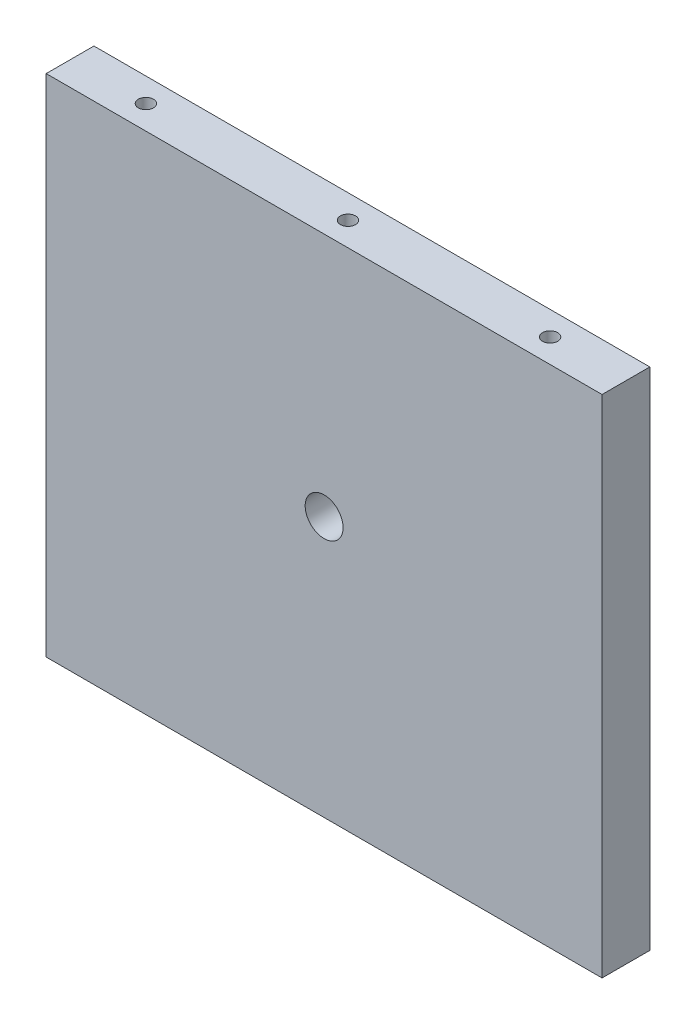
ISO-10303-21;
HEADER;
FILE_DESCRIPTION(('STEP AP214'),'2;1');
FILE_NAME('part.step','',(''),(''),'','','');
FILE_SCHEMA(('AUTOMOTIVE_DESIGN { 1 0 10303 214 1 1 1 1 }'));
ENDSEC;
DATA;
#1=APPLICATION_CONTEXT('core data for automotive mechanical design processes');
#2=APPLICATION_PROTOCOL_DEFINITION('international standard','automotive_design',2000,#1);
#3=PRODUCT_CONTEXT('',#1,'mechanical');
#4=PRODUCT('Part','Part','',(#3));
#5=PRODUCT_RELATED_PRODUCT_CATEGORY('part','',(#4));
#6=PRODUCT_DEFINITION_FORMATION('','',#4);
#7=PRODUCT_DEFINITION_CONTEXT('part definition',#1,'design');
#8=PRODUCT_DEFINITION('design','',#6,#7);
#9=PRODUCT_DEFINITION_SHAPE('','',#8);
#10=(LENGTH_UNIT() NAMED_UNIT(*) SI_UNIT(.MILLI.,.METRE.));
#11=(NAMED_UNIT(*) PLANE_ANGLE_UNIT() SI_UNIT($,.RADIAN.));
#12=(NAMED_UNIT(*) SI_UNIT($,.STERADIAN.) SOLID_ANGLE_UNIT());
#13=UNCERTAINTY_MEASURE_WITH_UNIT(LENGTH_MEASURE(1.E-05),#10,'distance_accuracy_value','');
#14=(GEOMETRIC_REPRESENTATION_CONTEXT(3) GLOBAL_UNCERTAINTY_ASSIGNED_CONTEXT((#13)) GLOBAL_UNIT_ASSIGNED_CONTEXT((#10,
#11,#12)) REPRESENTATION_CONTEXT('',''));
#15=CARTESIAN_POINT('',(0.,0.,0.));
#16=DIRECTION('',(0.,0.,1.));
#17=DIRECTION('',(1.,0.,0.));
#18=AXIS2_PLACEMENT_3D('',#15,#16,#17);
#19=CARTESIAN_POINT('',(0.,0.,12.));
#20=DIRECTION('',(0.,0.,1.));
#21=DIRECTION('',(1.,0.,0.));
#22=AXIS2_PLACEMENT_3D('',#19,#20,#21);
#23=PLANE('',#22);
#24=DIRECTION('',(0.,1.,0.));
#25=VECTOR('',#24,1.);
#26=CARTESIAN_POINT('',(69.85,76.2,12.));
#27=LINE('',#26,#25);
#28=CARTESIAN_POINT('',(69.85,-50.8,12.));
#29=VERTEX_POINT('',#28);
#30=CARTESIAN_POINT('',(69.85,76.2,12.));
#31=VERTEX_POINT('',#30);
#32=EDGE_CURVE('E177',#29,#31,#27,.T.);
#33=ORIENTED_EDGE('',*,*,#32,.T.);
#34=DIRECTION('',(-1.,0.,0.));
#35=VECTOR('',#34,1.);
#36=CARTESIAN_POINT('',(-69.85,76.2,12.));
#37=LINE('',#36,#35);
#38=CARTESIAN_POINT('',(-69.85,76.2,12.));
#39=VERTEX_POINT('',#38);
#40=EDGE_CURVE('E92',#31,#39,#37,.T.);
#41=ORIENTED_EDGE('',*,*,#40,.T.);
#42=DIRECTION('',(0.,-1.,0.));
#43=VECTOR('',#42,1.);
#44=CARTESIAN_POINT('',(-69.85,76.2,12.));
#45=LINE('',#44,#43);
#46=CARTESIAN_POINT('',(-69.85,-50.8,12.));
#47=VERTEX_POINT('',#46);
#48=EDGE_CURVE('E182',#39,#47,#45,.T.);
#49=ORIENTED_EDGE('',*,*,#48,.T.);
#50=DIRECTION('',(1.,0.,0.));
#51=VECTOR('',#50,1.);
#52=CARTESIAN_POINT('',(-69.85,-50.8,12.));
#53=LINE('',#52,#51);
#54=EDGE_CURVE('E61',#47,#29,#53,.T.);
#55=ORIENTED_EDGE('',*,*,#54,.T.);
#56=EDGE_LOOP('',(#33,#41,#49,#55));
#57=FACE_BOUND('',#56,.T.);
#58=CARTESIAN_POINT('',(0.,14.67,12.));
#59=DIRECTION('',(0.,0.,1.));
#60=DIRECTION('',(1.,0.,0.));
#61=AXIS2_PLACEMENT_3D('',#58,#59,#60);
#62=CIRCLE('',#61,4.7625);
#63=CARTESIAN_POINT('',(4.7625,14.67,12.));
#64=VERTEX_POINT('',#63);
#65=EDGE_CURVE('E169',#64,#64,#62,.T.);
#66=ORIENTED_EDGE('',*,*,#65,.F.);
#67=EDGE_LOOP('',(#66));
#68=FACE_BOUND('',#67,.T.);
#69=ADVANCED_FACE('F43',(#57,#68),#23,.T.);
#70=CARTESIAN_POINT('',(0.,0.,0.));
#71=DIRECTION('',(0.,0.,1.));
#72=DIRECTION('',(1.,0.,0.));
#73=AXIS2_PLACEMENT_3D('',#70,#71,#72);
#74=PLANE('',#73);
#75=DIRECTION('',(0.,1.,0.));
#76=VECTOR('',#75,1.);
#77=CARTESIAN_POINT('',(69.85,76.2,0.));
#78=LINE('',#77,#76);
#79=CARTESIAN_POINT('',(69.85,-50.8,0.));
#80=VERTEX_POINT('',#79);
#81=CARTESIAN_POINT('',(69.85,76.2,0.));
#82=VERTEX_POINT('',#81);
#83=EDGE_CURVE('E173',#80,#82,#78,.T.);
#84=ORIENTED_EDGE('',*,*,#83,.F.);
#85=DIRECTION('',(1.,0.,0.));
#86=VECTOR('',#85,1.);
#87=CARTESIAN_POINT('',(-69.85,-50.8,0.));
#88=LINE('',#87,#86);
#89=CARTESIAN_POINT('',(-69.85,-50.8,0.));
#90=VERTEX_POINT('',#89);
#91=EDGE_CURVE('E85',#90,#80,#88,.T.);
#92=ORIENTED_EDGE('',*,*,#91,.F.);
#93=DIRECTION('',(0.,-1.,0.));
#94=VECTOR('',#93,1.);
#95=CARTESIAN_POINT('',(-69.85,76.2,0.));
#96=LINE('',#95,#94);
#97=CARTESIAN_POINT('',(-69.85,76.2,0.));
#98=VERTEX_POINT('',#97);
#99=EDGE_CURVE('E79',#98,#90,#96,.T.);
#100=ORIENTED_EDGE('',*,*,#99,.F.);
#101=DIRECTION('',(-1.,0.,0.));
#102=VECTOR('',#101,1.);
#103=CARTESIAN_POINT('',(-69.85,76.2,0.));
#104=LINE('',#103,#102);
#105=EDGE_CURVE('E191',#82,#98,#104,.T.);
#106=ORIENTED_EDGE('',*,*,#105,.F.);
#107=EDGE_LOOP('',(#84,#92,#100,#106));
#108=FACE_BOUND('',#107,.T.);
#109=CARTESIAN_POINT('',(0.,14.67,0.));
#110=DIRECTION('',(0.,0.,1.));
#111=DIRECTION('',(1.,0.,0.));
#112=AXIS2_PLACEMENT_3D('',#109,#110,#111);
#113=CIRCLE('',#112,4.7625);
#114=CARTESIAN_POINT('',(4.7625,14.67,0.));
#115=VERTEX_POINT('',#114);
#116=EDGE_CURVE('E168',#115,#115,#113,.T.);
#117=ORIENTED_EDGE('',*,*,#116,.T.);
#118=EDGE_LOOP('',(#117));
#119=FACE_BOUND('',#118,.T.);
#120=ADVANCED_FACE('F207',(#108,#119),#74,.F.);
#121=CARTESIAN_POINT('',(69.85,76.2,12.));
#122=DIRECTION('',(-1.,0.,0.));
#123=DIRECTION('',(0.,0.,1.));
#124=AXIS2_PLACEMENT_3D('',#121,#122,#123);
#125=PLANE('',#124);
#126=ORIENTED_EDGE('',*,*,#83,.T.);
#127=DIRECTION('',(0.,0.,-1.));
#128=VECTOR('',#127,1.);
#129=CARTESIAN_POINT('',(69.85,76.2,12.));
#130=LINE('',#129,#128);
#131=EDGE_CURVE('E11',#31,#82,#130,.T.);
#132=ORIENTED_EDGE('',*,*,#131,.F.);
#133=ORIENTED_EDGE('',*,*,#32,.F.);
#134=DIRECTION('',(0.,0.,-1.));
#135=VECTOR('',#134,1.);
#136=CARTESIAN_POINT('',(69.85,-50.8,12.));
#137=LINE('',#136,#135);
#138=EDGE_CURVE('E187',#29,#80,#137,.T.);
#139=ORIENTED_EDGE('',*,*,#138,.T.);
#140=EDGE_LOOP('',(#126,#132,#133,#139));
#141=FACE_BOUND('',#140,.T.);
#142=ADVANCED_FACE('F45',(#141),#125,.F.);
#143=CARTESIAN_POINT('',(-69.85,76.2,12.));
#144=DIRECTION('',(0.,-1.,0.));
#145=DIRECTION('',(0.,0.,-1.));
#146=AXIS2_PLACEMENT_3D('',#143,#144,#145);
#147=PLANE('',#146);
#148=CARTESIAN_POINT('',(50.8,76.2,6.));
#149=DIRECTION('',(0.,1.,0.));
#150=DIRECTION('',(0.,0.,1.));
#151=AXIS2_PLACEMENT_3D('',#148,#149,#150);
#152=CIRCLE('',#151,1.89864999999999);
#153=CARTESIAN_POINT('',(50.8,76.2,7.89864999999999));
#154=VERTEX_POINT('',#153);
#155=EDGE_CURVE('E123',#154,#154,#152,.T.);
#156=ORIENTED_EDGE('',*,*,#155,.F.);
#157=EDGE_LOOP('',(#156));
#158=FACE_BOUND('',#157,.T.);
#159=CARTESIAN_POINT('',(0.,76.2,6.));
#160=DIRECTION('',(0.,1.,0.));
#161=DIRECTION('',(0.,0.,1.));
#162=AXIS2_PLACEMENT_3D('',#159,#160,#161);
#163=CIRCLE('',#162,1.89864999999999);
#164=CARTESIAN_POINT('',(0.,76.2,7.89864999999999));
#165=VERTEX_POINT('',#164);
#166=EDGE_CURVE('E122',#165,#165,#163,.T.);
#167=ORIENTED_EDGE('',*,*,#166,.F.);
#168=EDGE_LOOP('',(#167));
#169=FACE_BOUND('',#168,.T.);
#170=CARTESIAN_POINT('',(-50.8,76.2,6.));
#171=DIRECTION('',(0.,1.,0.));
#172=DIRECTION('',(0.,0.,1.));
#173=AXIS2_PLACEMENT_3D('',#170,#171,#172);
#174=CIRCLE('',#173,1.89864999999999);
#175=CARTESIAN_POINT('',(-50.8,76.2,7.89864999999999));
#176=VERTEX_POINT('',#175);
#177=EDGE_CURVE('E136',#176,#176,#174,.T.);
#178=ORIENTED_EDGE('',*,*,#177,.F.);
#179=EDGE_LOOP('',(#178));
#180=FACE_BOUND('',#179,.T.);
#181=ORIENTED_EDGE('',*,*,#105,.T.);
#182=DIRECTION('',(0.,0.,-1.));
#183=VECTOR('',#182,1.);
#184=CARTESIAN_POINT('',(-69.85,76.2,12.));
#185=LINE('',#184,#183);
#186=EDGE_CURVE('E53',#39,#98,#185,.T.);
#187=ORIENTED_EDGE('',*,*,#186,.F.);
#188=ORIENTED_EDGE('',*,*,#40,.F.);
#189=ORIENTED_EDGE('',*,*,#131,.T.);
#190=EDGE_LOOP('',(#181,#187,#188,#189));
#191=FACE_BOUND('',#190,.T.);
#192=ADVANCED_FACE('F224',(#158,#169,#180,#191),#147,.F.);
#193=CARTESIAN_POINT('',(-69.85,76.2,12.));
#194=DIRECTION('',(1.,0.,0.));
#195=DIRECTION('',(0.,1.,0.));
#196=AXIS2_PLACEMENT_3D('',#193,#194,#195);
#197=PLANE('',#196);
#198=ORIENTED_EDGE('',*,*,#99,.T.);
#199=DIRECTION('',(0.,0.,-1.));
#200=VECTOR('',#199,1.);
#201=CARTESIAN_POINT('',(-69.85,-50.8,12.));
#202=LINE('',#201,#200);
#203=EDGE_CURVE('E200',#47,#90,#202,.T.);
#204=ORIENTED_EDGE('',*,*,#203,.F.);
#205=ORIENTED_EDGE('',*,*,#48,.F.);
#206=ORIENTED_EDGE('',*,*,#186,.T.);
#207=EDGE_LOOP('',(#198,#204,#205,#206));
#208=FACE_BOUND('',#207,.T.);
#209=ADVANCED_FACE('F204',(#208),#197,.F.);
#210=CARTESIAN_POINT('',(-69.85,-50.8,12.));
#211=DIRECTION('',(0.,1.,0.));
#212=DIRECTION('',(0.,0.,1.));
#213=AXIS2_PLACEMENT_3D('',#210,#211,#212);
#214=PLANE('',#213);
#215=CARTESIAN_POINT('',(50.8,-50.8,6.));
#216=DIRECTION('',(0.,-1.,0.));
#217=DIRECTION('',(0.,0.,-1.));
#218=AXIS2_PLACEMENT_3D('',#215,#216,#217);
#219=CIRCLE('',#218,1.89864999999999);
#220=CARTESIAN_POINT('',(50.8,-50.8,4.10135000000001));
#221=VERTEX_POINT('',#220);
#222=EDGE_CURVE('E144',#221,#221,#219,.T.);
#223=ORIENTED_EDGE('',*,*,#222,.F.);
#224=EDGE_LOOP('',(#223));
#225=FACE_BOUND('',#224,.T.);
#226=CARTESIAN_POINT('',(0.,-50.8,6.));
#227=DIRECTION('',(0.,-1.,0.));
#228=DIRECTION('',(0.,0.,-1.));
#229=AXIS2_PLACEMENT_3D('',#226,#227,#228);
#230=CIRCLE('',#229,1.89864999999999);
#231=CARTESIAN_POINT('',(0.,-50.8,4.10135000000001));
#232=VERTEX_POINT('',#231);
#233=EDGE_CURVE('E152',#232,#232,#230,.T.);
#234=ORIENTED_EDGE('',*,*,#233,.F.);
#235=EDGE_LOOP('',(#234));
#236=FACE_BOUND('',#235,.T.);
#237=CARTESIAN_POINT('',(-50.8,-50.8,6.));
#238=DIRECTION('',(0.,-1.,0.));
#239=DIRECTION('',(0.,0.,-1.));
#240=AXIS2_PLACEMENT_3D('',#237,#238,#239);
#241=CIRCLE('',#240,1.89864999999999);
#242=CARTESIAN_POINT('',(-50.8,-50.8,4.10135000000001));
#243=VERTEX_POINT('',#242);
#244=EDGE_CURVE('E160',#243,#243,#241,.T.);
#245=ORIENTED_EDGE('',*,*,#244,.F.);
#246=EDGE_LOOP('',(#245));
#247=FACE_BOUND('',#246,.T.);
#248=ORIENTED_EDGE('',*,*,#91,.T.);
#249=ORIENTED_EDGE('',*,*,#138,.F.);
#250=ORIENTED_EDGE('',*,*,#54,.F.);
#251=ORIENTED_EDGE('',*,*,#203,.T.);
#252=EDGE_LOOP('',(#248,#249,#250,#251));
#253=FACE_BOUND('',#252,.T.);
#254=ADVANCED_FACE('F212',(#225,#236,#247,#253),#214,.F.);
#255=CARTESIAN_POINT('',(0.,14.67,12.));
#256=DIRECTION('',(0.,0.,-1.));
#257=DIRECTION('',(-1.,0.,0.));
#258=AXIS2_PLACEMENT_3D('',#255,#256,#257);
#259=CYLINDRICAL_SURFACE('',#258,4.7625);
#260=ORIENTED_EDGE('',*,*,#65,.T.);
#261=EDGE_LOOP('',(#260));
#262=FACE_BOUND('',#261,.T.);
#263=ORIENTED_EDGE('',*,*,#116,.F.);
#264=EDGE_LOOP('',(#263));
#265=FACE_BOUND('',#264,.T.);
#266=ADVANCED_FACE('F214',(#262,#265),#259,.F.);
#267=CARTESIAN_POINT('',(-50.8,-38.1,6.));
#268=DIRECTION('',(0.,-1.,0.));
#269=DIRECTION('',(0.,0.,-1.));
#270=AXIS2_PLACEMENT_3D('',#267,#268,#269);
#271=CONICAL_SURFACE('',#270,1.89864999999999,1.02974425867666);
#272=CARTESIAN_POINT('',(-50.8,-36.9591759856833,6.));
#273=VERTEX_POINT('',#272);
#274=VERTEX_LOOP('',#273);
#275=FACE_BOUND('',#274,.T.);
#276=CARTESIAN_POINT('',(-50.8,-38.1,6.));
#277=DIRECTION('',(0.,-1.,0.));
#278=DIRECTION('',(0.,0.,-1.));
#279=AXIS2_PLACEMENT_3D('',#276,#277,#278);
#280=CIRCLE('',#279,1.89864999999999);
#281=CARTESIAN_POINT('',(-50.8,-38.1,4.10135000000001));
#282=VERTEX_POINT('',#281);
#283=EDGE_CURVE('E164',#282,#282,#280,.T.);
#284=ORIENTED_EDGE('',*,*,#283,.T.);
#285=EDGE_LOOP('',(#284));
#286=FACE_BOUND('',#285,.T.);
#287=ADVANCED_FACE('F221',(#275,#286),#271,.F.);
#288=CARTESIAN_POINT('',(-50.8,-50.8,6.));
#289=DIRECTION('',(0.,-1.,0.));
#290=DIRECTION('',(0.,0.,-1.));
#291=AXIS2_PLACEMENT_3D('',#288,#289,#290);
#292=CYLINDRICAL_SURFACE('',#291,1.89864999999999);
#293=ORIENTED_EDGE('',*,*,#283,.F.);
#294=EDGE_LOOP('',(#293));
#295=FACE_BOUND('',#294,.T.);
#296=ORIENTED_EDGE('',*,*,#244,.T.);
#297=EDGE_LOOP('',(#296));
#298=FACE_BOUND('',#297,.T.);
#299=ADVANCED_FACE('F238',(#295,#298),#292,.F.);
#300=CARTESIAN_POINT('',(0.,-38.1,6.));
#301=DIRECTION('',(0.,-1.,0.));
#302=DIRECTION('',(0.,0.,-1.));
#303=AXIS2_PLACEMENT_3D('',#300,#301,#302);
#304=CONICAL_SURFACE('',#303,1.89865,1.02974425867666);
#305=CARTESIAN_POINT('',(0.,-36.9591759856833,6.));
#306=VERTEX_POINT('',#305);
#307=VERTEX_LOOP('',#306);
#308=FACE_BOUND('',#307,.T.);
#309=CARTESIAN_POINT('',(0.,-38.1,6.));
#310=DIRECTION('',(0.,-1.,0.));
#311=DIRECTION('',(0.,0.,-1.));
#312=AXIS2_PLACEMENT_3D('',#309,#310,#311);
#313=CIRCLE('',#312,1.89865);
#314=CARTESIAN_POINT('',(0.,-38.1,4.10135));
#315=VERTEX_POINT('',#314);
#316=EDGE_CURVE('E156',#315,#315,#313,.T.);
#317=ORIENTED_EDGE('',*,*,#316,.T.);
#318=EDGE_LOOP('',(#317));
#319=FACE_BOUND('',#318,.T.);
#320=ADVANCED_FACE('F242',(#308,#319),#304,.F.);
#321=CARTESIAN_POINT('',(0.,-50.8,6.));
#322=DIRECTION('',(0.,-1.,0.));
#323=DIRECTION('',(0.,0.,-1.));
#324=AXIS2_PLACEMENT_3D('',#321,#322,#323);
#325=CYLINDRICAL_SURFACE('',#324,1.89864999999999);
#326=ORIENTED_EDGE('',*,*,#316,.F.);
#327=EDGE_LOOP('',(#326));
#328=FACE_BOUND('',#327,.T.);
#329=ORIENTED_EDGE('',*,*,#233,.T.);
#330=EDGE_LOOP('',(#329));
#331=FACE_BOUND('',#330,.T.);
#332=ADVANCED_FACE('F246',(#328,#331),#325,.F.);
#333=CARTESIAN_POINT('',(50.8,-38.1,6.));
#334=DIRECTION('',(0.,-1.,0.));
#335=DIRECTION('',(0.,0.,-1.));
#336=AXIS2_PLACEMENT_3D('',#333,#334,#335);
#337=CONICAL_SURFACE('',#336,1.89864999999999,1.02974425867666);
#338=CARTESIAN_POINT('',(50.8,-36.9591759856833,6.));
#339=VERTEX_POINT('',#338);
#340=VERTEX_LOOP('',#339);
#341=FACE_BOUND('',#340,.T.);
#342=CARTESIAN_POINT('',(50.8,-38.1,6.));
#343=DIRECTION('',(0.,-1.,0.));
#344=DIRECTION('',(0.,0.,-1.));
#345=AXIS2_PLACEMENT_3D('',#342,#343,#344);
#346=CIRCLE('',#345,1.89864999999999);
#347=CARTESIAN_POINT('',(50.8,-38.1,4.10135000000001));
#348=VERTEX_POINT('',#347);
#349=EDGE_CURVE('E148',#348,#348,#346,.T.);
#350=ORIENTED_EDGE('',*,*,#349,.T.);
#351=EDGE_LOOP('',(#350));
#352=FACE_BOUND('',#351,.T.);
#353=ADVANCED_FACE('F250',(#341,#352),#337,.F.);
#354=CARTESIAN_POINT('',(50.8,-50.8,6.));
#355=DIRECTION('',(0.,-1.,0.));
#356=DIRECTION('',(0.,0.,-1.));
#357=AXIS2_PLACEMENT_3D('',#354,#355,#356);
#358=CYLINDRICAL_SURFACE('',#357,1.89864999999999);
#359=ORIENTED_EDGE('',*,*,#349,.F.);
#360=EDGE_LOOP('',(#359));
#361=FACE_BOUND('',#360,.T.);
#362=ORIENTED_EDGE('',*,*,#222,.T.);
#363=EDGE_LOOP('',(#362));
#364=FACE_BOUND('',#363,.T.);
#365=ADVANCED_FACE('F254',(#361,#364),#358,.F.);
#366=CARTESIAN_POINT('',(-50.8,63.5,6.));
#367=DIRECTION('',(0.,1.,0.));
#368=DIRECTION('',(0.,0.,1.));
#369=AXIS2_PLACEMENT_3D('',#366,#367,#368);
#370=CONICAL_SURFACE('',#369,1.89864999999999,1.02974425867666);
#371=CARTESIAN_POINT('',(-50.8,62.3591759856833,6.));
#372=VERTEX_POINT('',#371);
#373=VERTEX_LOOP('',#372);
#374=FACE_BOUND('',#373,.T.);
#375=CARTESIAN_POINT('',(-50.8,63.5,6.));
#376=DIRECTION('',(0.,1.,0.));
#377=DIRECTION('',(0.,0.,1.));
#378=AXIS2_PLACEMENT_3D('',#375,#376,#377);
#379=CIRCLE('',#378,1.89864999999999);
#380=CARTESIAN_POINT('',(-50.8,63.5,7.89864999999999));
#381=VERTEX_POINT('',#380);
#382=EDGE_CURVE('E140',#381,#381,#379,.T.);
#383=ORIENTED_EDGE('',*,*,#382,.T.);
#384=EDGE_LOOP('',(#383));
#385=FACE_BOUND('',#384,.T.);
#386=ADVANCED_FACE('F258',(#374,#385),#370,.F.);
#387=CARTESIAN_POINT('',(-50.8,76.2,6.));
#388=DIRECTION('',(0.,1.,0.));
#389=DIRECTION('',(0.,0.,1.));
#390=AXIS2_PLACEMENT_3D('',#387,#388,#389);
#391=CYLINDRICAL_SURFACE('',#390,1.89864999999999);
#392=ORIENTED_EDGE('',*,*,#382,.F.);
#393=EDGE_LOOP('',(#392));
#394=FACE_BOUND('',#393,.T.);
#395=ORIENTED_EDGE('',*,*,#177,.T.);
#396=EDGE_LOOP('',(#395));
#397=FACE_BOUND('',#396,.T.);
#398=ADVANCED_FACE('F262',(#394,#397),#391,.F.);
#399=CARTESIAN_POINT('',(0.,63.5,6.));
#400=DIRECTION('',(0.,1.,0.));
#401=DIRECTION('',(0.,0.,1.));
#402=AXIS2_PLACEMENT_3D('',#399,#400,#401);
#403=CONICAL_SURFACE('',#402,1.89865,1.02974425867666);
#404=CARTESIAN_POINT('',(0.,62.3591759856833,6.));
#405=VERTEX_POINT('',#404);
#406=VERTEX_LOOP('',#405);
#407=FACE_BOUND('',#406,.T.);
#408=CARTESIAN_POINT('',(0.,63.5,6.));
#409=DIRECTION('',(0.,1.,0.));
#410=DIRECTION('',(0.,0.,1.));
#411=AXIS2_PLACEMENT_3D('',#408,#409,#410);
#412=CIRCLE('',#411,1.89865);
#413=CARTESIAN_POINT('',(0.,63.5,7.89865));
#414=VERTEX_POINT('',#413);
#415=EDGE_CURVE('E128',#414,#414,#412,.T.);
#416=ORIENTED_EDGE('',*,*,#415,.T.);
#417=EDGE_LOOP('',(#416));
#418=FACE_BOUND('',#417,.T.);
#419=ADVANCED_FACE('F266',(#407,#418),#403,.F.);
#420=CARTESIAN_POINT('',(0.,76.2,6.));
#421=DIRECTION('',(0.,1.,0.));
#422=DIRECTION('',(0.,0.,1.));
#423=AXIS2_PLACEMENT_3D('',#420,#421,#422);
#424=CYLINDRICAL_SURFACE('',#423,1.89864999999999);
#425=ORIENTED_EDGE('',*,*,#415,.F.);
#426=EDGE_LOOP('',(#425));
#427=FACE_BOUND('',#426,.T.);
#428=ORIENTED_EDGE('',*,*,#166,.T.);
#429=EDGE_LOOP('',(#428));
#430=FACE_BOUND('',#429,.T.);
#431=ADVANCED_FACE('F115',(#427,#430),#424,.F.);
#432=CARTESIAN_POINT('',(50.8,63.5,6.));
#433=DIRECTION('',(0.,1.,0.));
#434=DIRECTION('',(0.,0.,1.));
#435=AXIS2_PLACEMENT_3D('',#432,#433,#434);
#436=CONICAL_SURFACE('',#435,1.89864999999999,1.02974425867666);
#437=CARTESIAN_POINT('',(50.8,62.3591759856833,6.));
#438=VERTEX_POINT('',#437);
#439=VERTEX_LOOP('',#438);
#440=FACE_BOUND('',#439,.T.);
#441=CARTESIAN_POINT('',(50.8,63.5,6.));
#442=DIRECTION('',(0.,1.,0.));
#443=DIRECTION('',(0.,0.,1.));
#444=AXIS2_PLACEMENT_3D('',#441,#442,#443);
#445=CIRCLE('',#444,1.89864999999999);
#446=CARTESIAN_POINT('',(50.8,63.5,7.89864999999999));
#447=VERTEX_POINT('',#446);
#448=EDGE_CURVE('E119',#447,#447,#445,.T.);
#449=ORIENTED_EDGE('',*,*,#448,.T.);
#450=EDGE_LOOP('',(#449));
#451=FACE_BOUND('',#450,.T.);
#452=ADVANCED_FACE('F111',(#440,#451),#436,.F.);
#453=CARTESIAN_POINT('',(50.8,76.2,6.));
#454=DIRECTION('',(0.,1.,0.));
#455=DIRECTION('',(0.,0.,1.));
#456=AXIS2_PLACEMENT_3D('',#453,#454,#455);
#457=CYLINDRICAL_SURFACE('',#456,1.89864999999999);
#458=ORIENTED_EDGE('',*,*,#448,.F.);
#459=EDGE_LOOP('',(#458));
#460=FACE_BOUND('',#459,.T.);
#461=ORIENTED_EDGE('',*,*,#155,.T.);
#462=EDGE_LOOP('',(#461));
#463=FACE_BOUND('',#462,.T.);
#464=ADVANCED_FACE('F114',(#460,#463),#457,.F.);
#465=CLOSED_SHELL('',(#69,#120,#142,#192,#209,#254,#266,#287,#299,#320,#332,#353,#365,#386,#398,
#419,#431,#452,#464));
#466=MANIFOLD_SOLID_BREP('B2',#465);
#467=ADVANCED_BREP_SHAPE_REPRESENTATION('',(#18,#466),#14);
#468=SHAPE_DEFINITION_REPRESENTATION(#9,#467);
ENDSEC;
END-ISO-10303-21;
